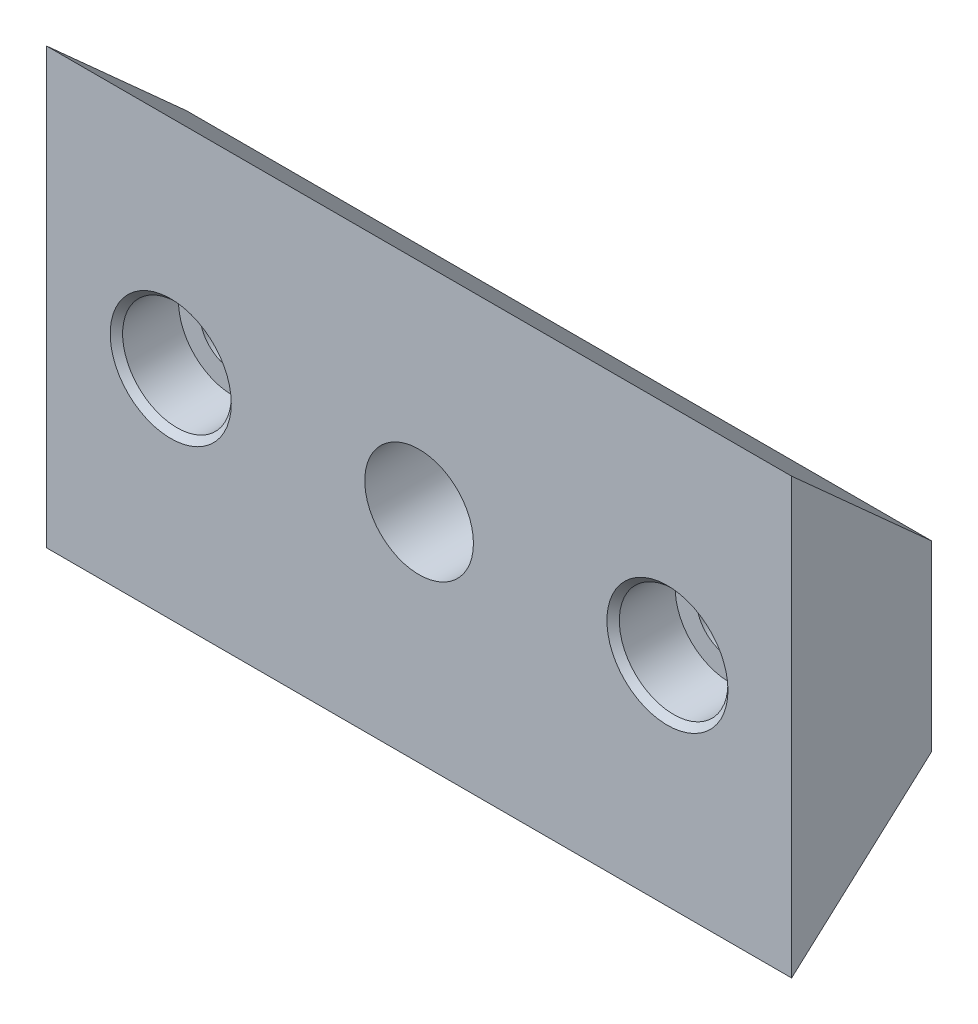
ISO-10303-21;
HEADER;
FILE_DESCRIPTION(('STEP AP214'),'2;1');
FILE_NAME('part.step','',(''),(''),'','','');
FILE_SCHEMA(('AUTOMOTIVE_DESIGN { 1 0 10303 214 1 1 1 1 }'));
ENDSEC;
DATA;
#1=APPLICATION_CONTEXT('core data for automotive mechanical design processes');
#2=APPLICATION_PROTOCOL_DEFINITION('international standard','automotive_design',2000,#1);
#3=PRODUCT_CONTEXT('',#1,'mechanical');
#4=PRODUCT('Part','Part','',(#3));
#5=PRODUCT_RELATED_PRODUCT_CATEGORY('part','',(#4));
#6=PRODUCT_DEFINITION_FORMATION('','',#4);
#7=PRODUCT_DEFINITION_CONTEXT('part definition',#1,'design');
#8=PRODUCT_DEFINITION('design','',#6,#7);
#9=PRODUCT_DEFINITION_SHAPE('','',#8);
#10=(LENGTH_UNIT() NAMED_UNIT(*) SI_UNIT(.MILLI.,.METRE.));
#11=(NAMED_UNIT(*) PLANE_ANGLE_UNIT() SI_UNIT($,.RADIAN.));
#12=(NAMED_UNIT(*) SI_UNIT($,.STERADIAN.) SOLID_ANGLE_UNIT());
#13=UNCERTAINTY_MEASURE_WITH_UNIT(LENGTH_MEASURE(1.E-05),#10,'distance_accuracy_value','');
#14=(GEOMETRIC_REPRESENTATION_CONTEXT(3) GLOBAL_UNCERTAINTY_ASSIGNED_CONTEXT((#13)) GLOBAL_UNIT_ASSIGNED_CONTEXT((#10,
#11,#12)) REPRESENTATION_CONTEXT('',''));
#15=CARTESIAN_POINT('',(0.,0.,0.));
#16=DIRECTION('',(0.,0.,1.));
#17=DIRECTION('',(1.,0.,0.));
#18=AXIS2_PLACEMENT_3D('',#15,#16,#17);
#19=CARTESIAN_POINT('',(-76.2,12.8759579142681,-14.3002));
#20=DIRECTION('',(0.,-0.743144825477391,-0.669130606358862));
#21=DIRECTION('',(0.,0.669130606358862,-0.743144825477391));
#22=AXIS2_PLACEMENT_3D('',#19,#20,#21);
#23=PLANE('',#22);
#24=DIRECTION('',(0.,0.669130606358862,-0.743144825477391));
#25=VECTOR('',#24,1.);
#26=CARTESIAN_POINT('',(0.,12.8759579142681,-14.3002));
#27=LINE('',#26,#25);
#28=CARTESIAN_POINT('',(0.,0.,0.));
#29=VERTEX_POINT('',#28);
#30=CARTESIAN_POINT('',(0.,12.8759579142681,-14.3002));
#31=VERTEX_POINT('',#30);
#32=EDGE_CURVE('E97',#29,#31,#27,.T.);
#33=ORIENTED_EDGE('',*,*,#32,.F.);
#34=DIRECTION('',(1.,0.,0.));
#35=VECTOR('',#34,1.);
#36=CARTESIAN_POINT('',(-76.2,0.,0.));
#37=LINE('',#36,#35);
#38=CARTESIAN_POINT('',(-76.2,0.,0.));
#39=VERTEX_POINT('',#38);
#40=EDGE_CURVE('E11',#39,#29,#37,.T.);
#41=ORIENTED_EDGE('',*,*,#40,.F.);
#42=DIRECTION('',(0.,0.669130606358862,-0.743144825477391));
#43=VECTOR('',#42,1.);
#44=CARTESIAN_POINT('',(-76.2,12.8759579142681,-14.3002));
#45=LINE('',#44,#43);
#46=CARTESIAN_POINT('',(-76.2,12.8759579142681,-14.3002));
#47=VERTEX_POINT('',#46);
#48=EDGE_CURVE('E90',#39,#47,#45,.T.);
#49=ORIENTED_EDGE('',*,*,#48,.T.);
#50=DIRECTION('',(1.,0.,0.));
#51=VECTOR('',#50,1.);
#52=CARTESIAN_POINT('',(-76.2,12.8759579142681,-14.3002));
#53=LINE('',#52,#51);
#54=EDGE_CURVE('E35',#47,#31,#53,.T.);
#55=ORIENTED_EDGE('',*,*,#54,.T.);
#56=EDGE_LOOP('',(#33,#41,#49,#55));
#57=FACE_BOUND('',#56,.T.);
#58=ADVANCED_FACE('F32',(#57),#23,.T.);
#59=CARTESIAN_POINT('',(-76.2,0.,0.));
#60=DIRECTION('',(0.,0.,1.));
#61=DIRECTION('',(1.,0.,0.));
#62=AXIS2_PLACEMENT_3D('',#59,#60,#61);
#63=PLANE('',#62);
#64=CARTESIAN_POINT('',(-38.1,22.225,0.));
#65=DIRECTION('',(0.,0.,1.));
#66=DIRECTION('',(1.,0.,0.));
#67=AXIS2_PLACEMENT_3D('',#64,#65,#66);
#68=CIRCLE('',#67,5.55624999999998);
#69=CARTESIAN_POINT('',(-32.54375,22.225,0.));
#70=VERTEX_POINT('',#69);
#71=EDGE_CURVE('E164',#70,#70,#68,.T.);
#72=ORIENTED_EDGE('',*,*,#71,.F.);
#73=EDGE_LOOP('',(#72));
#74=FACE_BOUND('',#73,.T.);
#75=CARTESIAN_POINT('',(-63.5,22.225,0.));
#76=DIRECTION('',(0.,0.,1.));
#77=DIRECTION('',(1.,0.,0.));
#78=AXIS2_PLACEMENT_3D('',#75,#76,#77);
#79=CIRCLE('',#78,6.19125);
#80=CARTESIAN_POINT('',(-57.30875,22.225,0.));
#81=VERTEX_POINT('',#80);
#82=EDGE_CURVE('E160',#81,#81,#79,.T.);
#83=ORIENTED_EDGE('',*,*,#82,.F.);
#84=EDGE_LOOP('',(#83));
#85=FACE_BOUND('',#84,.T.);
#86=CARTESIAN_POINT('',(-12.7,22.225,0.));
#87=DIRECTION('',(0.,0.,1.));
#88=DIRECTION('',(1.,0.,0.));
#89=AXIS2_PLACEMENT_3D('',#86,#87,#88);
#90=CIRCLE('',#89,6.19125);
#91=CARTESIAN_POINT('',(-6.50875,22.225,0.));
#92=VERTEX_POINT('',#91);
#93=EDGE_CURVE('E147',#92,#92,#90,.T.);
#94=ORIENTED_EDGE('',*,*,#93,.F.);
#95=EDGE_LOOP('',(#94));
#96=FACE_BOUND('',#95,.T.);
#97=DIRECTION('',(0.,-1.,0.));
#98=VECTOR('',#97,1.);
#99=CARTESIAN_POINT('',(0.,0.,0.));
#100=LINE('',#99,#98);
#101=CARTESIAN_POINT('',(0.,44.45,0.));
#102=VERTEX_POINT('',#101);
#103=EDGE_CURVE('E92',#102,#29,#100,.T.);
#104=ORIENTED_EDGE('',*,*,#103,.F.);
#105=DIRECTION('',(1.,0.,0.));
#106=VECTOR('',#105,1.);
#107=CARTESIAN_POINT('',(-76.2,44.45,0.));
#108=LINE('',#107,#106);
#109=CARTESIAN_POINT('',(-76.2,44.45,0.));
#110=VERTEX_POINT('',#109);
#111=EDGE_CURVE('E41',#110,#102,#108,.T.);
#112=ORIENTED_EDGE('',*,*,#111,.F.);
#113=DIRECTION('',(0.,-1.,0.));
#114=VECTOR('',#113,1.);
#115=CARTESIAN_POINT('',(-76.2,0.,0.));
#116=LINE('',#115,#114);
#117=EDGE_CURVE('E87',#110,#39,#116,.T.);
#118=ORIENTED_EDGE('',*,*,#117,.T.);
#119=ORIENTED_EDGE('',*,*,#40,.T.);
#120=EDGE_LOOP('',(#104,#112,#118,#119));
#121=FACE_BOUND('',#120,.T.);
#122=ADVANCED_FACE('F108',(#74,#85,#96,#121),#63,.T.);
#123=CARTESIAN_POINT('',(-76.2,44.45,0.));
#124=DIRECTION('',(0.,0.743144825477391,-0.669130606358862));
#125=DIRECTION('',(0.,0.669130606358862,0.743144825477391));
#126=AXIS2_PLACEMENT_3D('',#123,#124,#125);
#127=PLANE('',#126);
#128=DIRECTION('',(0.,0.669130606358862,0.743144825477391));
#129=VECTOR('',#128,1.);
#130=CARTESIAN_POINT('',(0.,44.45,0.));
#131=LINE('',#130,#129);
#132=CARTESIAN_POINT('',(0.,31.5740420857319,-14.3002));
#133=VERTEX_POINT('',#132);
#134=EDGE_CURVE('E82',#133,#102,#131,.T.);
#135=ORIENTED_EDGE('',*,*,#134,.F.);
#136=DIRECTION('',(1.,0.,0.));
#137=VECTOR('',#136,1.);
#138=CARTESIAN_POINT('',(-76.2,31.5740420857319,-14.3002));
#139=LINE('',#138,#137);
#140=CARTESIAN_POINT('',(-76.2,31.5740420857319,-14.3002));
#141=VERTEX_POINT('',#140);
#142=EDGE_CURVE('E77',#141,#133,#139,.T.);
#143=ORIENTED_EDGE('',*,*,#142,.F.);
#144=DIRECTION('',(0.,0.669130606358862,0.743144825477391));
#145=VECTOR('',#144,1.);
#146=CARTESIAN_POINT('',(-76.2,44.45,0.));
#147=LINE('',#146,#145);
#148=EDGE_CURVE('E80',#141,#110,#147,.T.);
#149=ORIENTED_EDGE('',*,*,#148,.T.);
#150=ORIENTED_EDGE('',*,*,#111,.T.);
#151=EDGE_LOOP('',(#135,#143,#149,#150));
#152=FACE_BOUND('',#151,.T.);
#153=ADVANCED_FACE('F79',(#152),#127,.T.);
#154=CARTESIAN_POINT('',(-76.2,31.5740420857319,-14.3002));
#155=DIRECTION('',(0.,0.,-1.));
#156=DIRECTION('',(-1.,0.,0.));
#157=AXIS2_PLACEMENT_3D('',#154,#155,#156);
#158=PLANE('',#157);
#159=CARTESIAN_POINT('',(-38.1,22.225,-14.3002));
#160=DIRECTION('',(0.,0.,1.));
#161=DIRECTION('',(1.,0.,0.));
#162=AXIS2_PLACEMENT_3D('',#159,#160,#161);
#163=CIRCLE('',#162,5.55625);
#164=CARTESIAN_POINT('',(-32.54375,22.225,-14.3002));
#165=VERTEX_POINT('',#164);
#166=EDGE_CURVE('E129',#165,#165,#163,.T.);
#167=ORIENTED_EDGE('',*,*,#166,.T.);
#168=EDGE_LOOP('',(#167));
#169=FACE_BOUND('',#168,.T.);
#170=CARTESIAN_POINT('',(-63.5,22.225,-14.3002));
#171=DIRECTION('',(0.,0.,1.));
#172=DIRECTION('',(1.,0.,0.));
#173=AXIS2_PLACEMENT_3D('',#170,#171,#172);
#174=CIRCLE('',#173,3.3782);
#175=CARTESIAN_POINT('',(-60.1218,22.225,-14.3002));
#176=VERTEX_POINT('',#175);
#177=EDGE_CURVE('E133',#176,#176,#174,.T.);
#178=ORIENTED_EDGE('',*,*,#177,.T.);
#179=EDGE_LOOP('',(#178));
#180=FACE_BOUND('',#179,.T.);
#181=CARTESIAN_POINT('',(-12.7,22.225,-14.3002));
#182=DIRECTION('',(0.,0.,1.));
#183=DIRECTION('',(1.,0.,0.));
#184=AXIS2_PLACEMENT_3D('',#181,#182,#183);
#185=CIRCLE('',#184,3.3782);
#186=CARTESIAN_POINT('',(-9.32180000000001,22.225,-14.3002));
#187=VERTEX_POINT('',#186);
#188=EDGE_CURVE('E101',#187,#187,#185,.T.);
#189=ORIENTED_EDGE('',*,*,#188,.T.);
#190=EDGE_LOOP('',(#189));
#191=FACE_BOUND('',#190,.T.);
#192=DIRECTION('',(0.,1.,0.));
#193=VECTOR('',#192,1.);
#194=CARTESIAN_POINT('',(0.,31.5740420857319,-14.3002));
#195=LINE('',#194,#193);
#196=EDGE_CURVE('E100',#31,#133,#195,.T.);
#197=ORIENTED_EDGE('',*,*,#196,.F.);
#198=ORIENTED_EDGE('',*,*,#54,.F.);
#199=DIRECTION('',(0.,1.,0.));
#200=VECTOR('',#199,1.);
#201=CARTESIAN_POINT('',(-76.2,31.5740420857319,-14.3002));
#202=LINE('',#201,#200);
#203=EDGE_CURVE('E86',#47,#141,#202,.T.);
#204=ORIENTED_EDGE('',*,*,#203,.T.);
#205=ORIENTED_EDGE('',*,*,#142,.T.);
#206=EDGE_LOOP('',(#197,#198,#204,#205));
#207=FACE_BOUND('',#206,.T.);
#208=ADVANCED_FACE('F89',(#169,#180,#191,#207),#158,.T.);
#209=CARTESIAN_POINT('',(-76.2,0.,0.));
#210=DIRECTION('',(1.,0.,0.));
#211=DIRECTION('',(0.,0.,-1.));
#212=AXIS2_PLACEMENT_3D('',#209,#210,#211);
#213=PLANE('',#212);
#214=ORIENTED_EDGE('',*,*,#48,.F.);
#215=ORIENTED_EDGE('',*,*,#117,.F.);
#216=ORIENTED_EDGE('',*,*,#148,.F.);
#217=ORIENTED_EDGE('',*,*,#203,.F.);
#218=EDGE_LOOP('',(#214,#215,#216,#217));
#219=FACE_BOUND('',#218,.T.);
#220=ADVANCED_FACE('F85',(#219),#213,.F.);
#221=CARTESIAN_POINT('',(0.,0.,0.));
#222=DIRECTION('',(1.,0.,0.));
#223=DIRECTION('',(0.,0.,-1.));
#224=AXIS2_PLACEMENT_3D('',#221,#222,#223);
#225=PLANE('',#224);
#226=ORIENTED_EDGE('',*,*,#32,.T.);
#227=ORIENTED_EDGE('',*,*,#196,.T.);
#228=ORIENTED_EDGE('',*,*,#134,.T.);
#229=ORIENTED_EDGE('',*,*,#103,.T.);
#230=EDGE_LOOP('',(#226,#227,#228,#229));
#231=FACE_BOUND('',#230,.T.);
#232=ADVANCED_FACE('F107',(#231),#225,.T.);
#233=CARTESIAN_POINT('',(-12.7,22.225,0.));
#234=DIRECTION('',(0.,0.,1.));
#235=DIRECTION('',(1.,0.,0.));
#236=AXIS2_PLACEMENT_3D('',#233,#234,#235);
#237=CYLINDRICAL_SURFACE('',#236,3.3782);
#238=ORIENTED_EDGE('',*,*,#188,.F.);
#239=EDGE_LOOP('',(#238));
#240=FACE_BOUND('',#239,.T.);
#241=CARTESIAN_POINT('',(-12.7,22.225,-6.34999999999999));
#242=DIRECTION('',(0.,0.,1.));
#243=DIRECTION('',(1.,0.,0.));
#244=AXIS2_PLACEMENT_3D('',#241,#242,#243);
#245=CIRCLE('',#244,3.37820000000001);
#246=CARTESIAN_POINT('',(-9.32179999999999,22.225,-6.34999999999999));
#247=VERTEX_POINT('',#246);
#248=EDGE_CURVE('E137',#247,#247,#245,.T.);
#249=ORIENTED_EDGE('',*,*,#248,.T.);
#250=EDGE_LOOP('',(#249));
#251=FACE_BOUND('',#250,.T.);
#252=ADVANCED_FACE('F201',(#240,#251),#237,.F.);
#253=CARTESIAN_POINT('',(-7.14375000000001,22.225,-6.34999999999999));
#254=DIRECTION('',(0.,0.,-1.));
#255=DIRECTION('',(-1.,0.,0.));
#256=AXIS2_PLACEMENT_3D('',#253,#254,#255);
#257=PLANE('',#256);
#258=ORIENTED_EDGE('',*,*,#248,.F.);
#259=EDGE_LOOP('',(#258));
#260=FACE_BOUND('',#259,.T.);
#261=CARTESIAN_POINT('',(-12.7,22.225,-6.34999999999999));
#262=DIRECTION('',(0.,0.,1.));
#263=DIRECTION('',(1.,0.,0.));
#264=AXIS2_PLACEMENT_3D('',#261,#262,#263);
#265=CIRCLE('',#264,5.55625);
#266=CARTESIAN_POINT('',(-7.14375000000001,22.225,-6.34999999999999));
#267=VERTEX_POINT('',#266);
#268=EDGE_CURVE('E139',#267,#267,#265,.T.);
#269=ORIENTED_EDGE('',*,*,#268,.T.);
#270=EDGE_LOOP('',(#269));
#271=FACE_BOUND('',#270,.T.);
#272=ADVANCED_FACE('F197',(#260,#271),#257,.F.);
#273=CARTESIAN_POINT('',(-12.7,22.225,0.));
#274=DIRECTION('',(0.,0.,1.));
#275=DIRECTION('',(1.,0.,0.));
#276=AXIS2_PLACEMENT_3D('',#273,#274,#275);
#277=CYLINDRICAL_SURFACE('',#276,5.55625);
#278=ORIENTED_EDGE('',*,*,#268,.F.);
#279=EDGE_LOOP('',(#278));
#280=FACE_BOUND('',#279,.T.);
#281=CARTESIAN_POINT('',(-12.7,22.225,-0.635000000000003));
#282=DIRECTION('',(0.,0.,1.));
#283=DIRECTION('',(1.,0.,0.));
#284=AXIS2_PLACEMENT_3D('',#281,#282,#283);
#285=CIRCLE('',#284,5.55625);
#286=CARTESIAN_POINT('',(-7.14375000000001,22.225,-0.635000000000003));
#287=VERTEX_POINT('',#286);
#288=EDGE_CURVE('E144',#287,#287,#285,.T.);
#289=ORIENTED_EDGE('',*,*,#288,.T.);
#290=EDGE_LOOP('',(#289));
#291=FACE_BOUND('',#290,.T.);
#292=ADVANCED_FACE('F193',(#280,#291),#277,.F.);
#293=CARTESIAN_POINT('',(-12.7,22.225,0.));
#294=DIRECTION('',(0.,0.,1.));
#295=DIRECTION('',(1.,0.,0.));
#296=AXIS2_PLACEMENT_3D('',#293,#294,#295);
#297=CONICAL_SURFACE('',#296,6.19125,0.785398163397447);
#298=ORIENTED_EDGE('',*,*,#288,.F.);
#299=EDGE_LOOP('',(#298));
#300=FACE_BOUND('',#299,.T.);
#301=ORIENTED_EDGE('',*,*,#93,.T.);
#302=EDGE_LOOP('',(#301));
#303=FACE_BOUND('',#302,.T.);
#304=ADVANCED_FACE('F189',(#300,#303),#297,.F.);
#305=CARTESIAN_POINT('',(-63.5,22.225,0.));
#306=DIRECTION('',(0.,0.,1.));
#307=DIRECTION('',(1.,0.,0.));
#308=AXIS2_PLACEMENT_3D('',#305,#306,#307);
#309=CYLINDRICAL_SURFACE('',#308,3.3782);
#310=ORIENTED_EDGE('',*,*,#177,.F.);
#311=EDGE_LOOP('',(#310));
#312=FACE_BOUND('',#311,.T.);
#313=CARTESIAN_POINT('',(-63.5,22.225,-6.34999999999999));
#314=DIRECTION('',(0.,0.,1.));
#315=DIRECTION('',(1.,0.,0.));
#316=AXIS2_PLACEMENT_3D('',#313,#314,#315);
#317=CIRCLE('',#316,3.37820000000001);
#318=CARTESIAN_POINT('',(-60.1218,22.225,-6.34999999999999));
#319=VERTEX_POINT('',#318);
#320=EDGE_CURVE('E151',#319,#319,#317,.T.);
#321=ORIENTED_EDGE('',*,*,#320,.T.);
#322=EDGE_LOOP('',(#321));
#323=FACE_BOUND('',#322,.T.);
#324=ADVANCED_FACE('F185',(#312,#323),#309,.F.);
#325=CARTESIAN_POINT('',(-57.94375,22.225,-6.34999999999999));
#326=DIRECTION('',(0.,0.,-1.));
#327=DIRECTION('',(-1.,0.,0.));
#328=AXIS2_PLACEMENT_3D('',#325,#326,#327);
#329=PLANE('',#328);
#330=ORIENTED_EDGE('',*,*,#320,.F.);
#331=EDGE_LOOP('',(#330));
#332=FACE_BOUND('',#331,.T.);
#333=CARTESIAN_POINT('',(-63.5,22.225,-6.34999999999999));
#334=DIRECTION('',(0.,0.,1.));
#335=DIRECTION('',(1.,0.,0.));
#336=AXIS2_PLACEMENT_3D('',#333,#334,#335);
#337=CIRCLE('',#336,5.55625);
#338=CARTESIAN_POINT('',(-57.94375,22.225,-6.34999999999999));
#339=VERTEX_POINT('',#338);
#340=EDGE_CURVE('E154',#339,#339,#337,.T.);
#341=ORIENTED_EDGE('',*,*,#340,.T.);
#342=EDGE_LOOP('',(#341));
#343=FACE_BOUND('',#342,.T.);
#344=ADVANCED_FACE('F181',(#332,#343),#329,.F.);
#345=CARTESIAN_POINT('',(-63.5,22.225,0.));
#346=DIRECTION('',(0.,0.,1.));
#347=DIRECTION('',(1.,0.,0.));
#348=AXIS2_PLACEMENT_3D('',#345,#346,#347);
#349=CYLINDRICAL_SURFACE('',#348,5.55625);
#350=ORIENTED_EDGE('',*,*,#340,.F.);
#351=EDGE_LOOP('',(#350));
#352=FACE_BOUND('',#351,.T.);
#353=CARTESIAN_POINT('',(-63.5,22.225,-0.635000000000003));
#354=DIRECTION('',(0.,0.,1.));
#355=DIRECTION('',(1.,0.,0.));
#356=AXIS2_PLACEMENT_3D('',#353,#354,#355);
#357=CIRCLE('',#356,5.55625);
#358=CARTESIAN_POINT('',(-57.94375,22.225,-0.635000000000003));
#359=VERTEX_POINT('',#358);
#360=EDGE_CURVE('E157',#359,#359,#357,.T.);
#361=ORIENTED_EDGE('',*,*,#360,.T.);
#362=EDGE_LOOP('',(#361));
#363=FACE_BOUND('',#362,.T.);
#364=ADVANCED_FACE('F175',(#352,#363),#349,.F.);
#365=CARTESIAN_POINT('',(-63.5,22.225,0.));
#366=DIRECTION('',(0.,0.,1.));
#367=DIRECTION('',(1.,0.,0.));
#368=AXIS2_PLACEMENT_3D('',#365,#366,#367);
#369=CONICAL_SURFACE('',#368,6.19125,0.785398163397442);
#370=ORIENTED_EDGE('',*,*,#360,.F.);
#371=EDGE_LOOP('',(#370));
#372=FACE_BOUND('',#371,.T.);
#373=ORIENTED_EDGE('',*,*,#82,.T.);
#374=EDGE_LOOP('',(#373));
#375=FACE_BOUND('',#374,.T.);
#376=ADVANCED_FACE('F169',(#372,#375),#369,.F.);
#377=CARTESIAN_POINT('',(-38.1,22.225,0.));
#378=DIRECTION('',(0.,0.,1.));
#379=DIRECTION('',(1.,0.,0.));
#380=AXIS2_PLACEMENT_3D('',#377,#378,#379);
#381=CYLINDRICAL_SURFACE('',#380,5.55624999999999);
#382=ORIENTED_EDGE('',*,*,#166,.F.);
#383=EDGE_LOOP('',(#382));
#384=FACE_BOUND('',#383,.T.);
#385=ORIENTED_EDGE('',*,*,#71,.T.);
#386=EDGE_LOOP('',(#385));
#387=FACE_BOUND('',#386,.T.);
#388=ADVANCED_FACE('F167',(#384,#387),#381,.F.);
#389=CLOSED_SHELL('',(#58,#122,#153,#208,#220,#232,#252,#272,#292,#304,#324,#344,#364,#376,#388));
#390=MANIFOLD_SOLID_BREP('B2',#389);
#391=ADVANCED_BREP_SHAPE_REPRESENTATION('',(#18,#390),#14);
#392=SHAPE_DEFINITION_REPRESENTATION(#9,#391);
ENDSEC;
END-ISO-10303-21;
